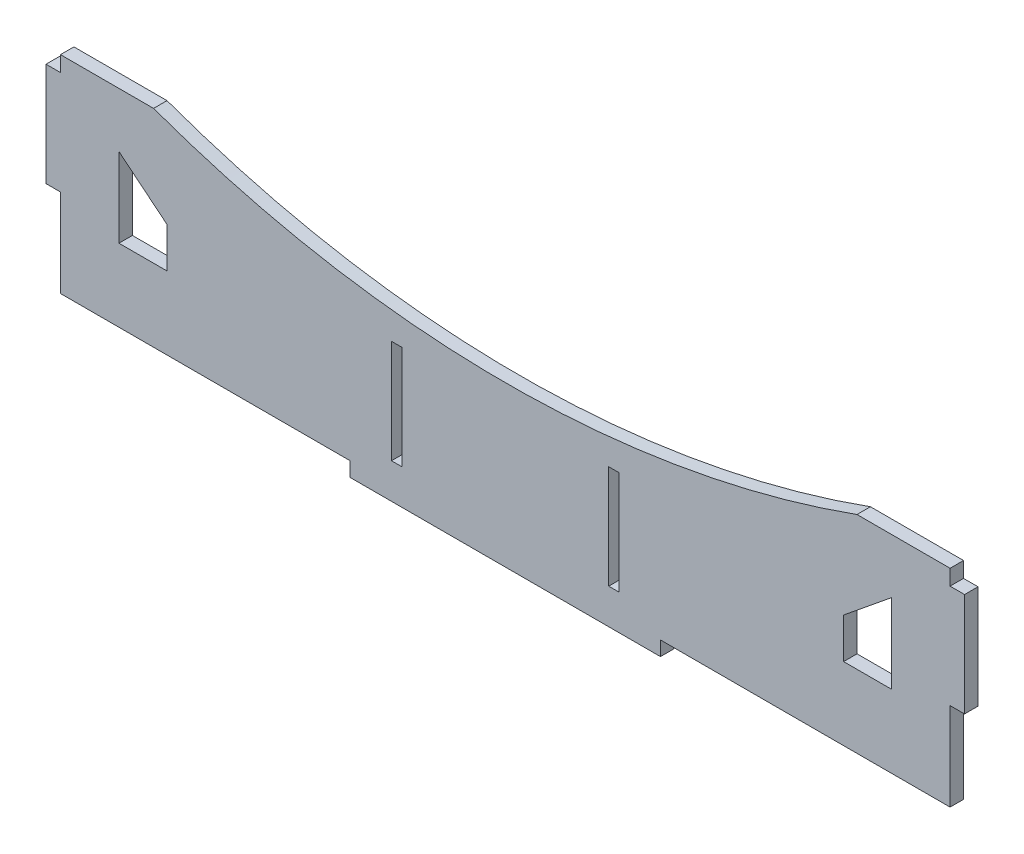
ISO-10303-21;
HEADER;
FILE_DESCRIPTION(('STEP AP214'),'2;1');
FILE_NAME('part.step','',(''),(''),'','','');
FILE_SCHEMA(('AUTOMOTIVE_DESIGN { 1 0 10303 214 1 1 1 1 }'));
ENDSEC;
DATA;
#1=APPLICATION_CONTEXT('core data for automotive mechanical design processes');
#2=APPLICATION_PROTOCOL_DEFINITION('international standard','automotive_design',2000,#1);
#3=PRODUCT_CONTEXT('',#1,'mechanical');
#4=PRODUCT('Part','Part','',(#3));
#5=PRODUCT_RELATED_PRODUCT_CATEGORY('part','',(#4));
#6=PRODUCT_DEFINITION_FORMATION('','',#4);
#7=PRODUCT_DEFINITION_CONTEXT('part definition',#1,'design');
#8=PRODUCT_DEFINITION('design','',#6,#7);
#9=PRODUCT_DEFINITION_SHAPE('','',#8);
#10=(LENGTH_UNIT() NAMED_UNIT(*) SI_UNIT(.MILLI.,.METRE.));
#11=(NAMED_UNIT(*) PLANE_ANGLE_UNIT() SI_UNIT($,.RADIAN.));
#12=(NAMED_UNIT(*) SI_UNIT($,.STERADIAN.) SOLID_ANGLE_UNIT());
#13=UNCERTAINTY_MEASURE_WITH_UNIT(LENGTH_MEASURE(1.E-05),#10,'distance_accuracy_value','');
#14=(GEOMETRIC_REPRESENTATION_CONTEXT(3) GLOBAL_UNCERTAINTY_ASSIGNED_CONTEXT((#13)) GLOBAL_UNIT_ASSIGNED_CONTEXT((#10,
#11,#12)) REPRESENTATION_CONTEXT('',''));
#15=CARTESIAN_POINT('',(0.,0.,0.));
#16=DIRECTION('',(0.,0.,1.));
#17=DIRECTION('',(1.,0.,0.));
#18=AXIS2_PLACEMENT_3D('',#15,#16,#17);
#19=CARTESIAN_POINT('',(-43.,10.,1.3));
#20=DIRECTION('',(0.,-1.,0.));
#21=DIRECTION('',(0.,0.,-1.));
#22=AXIS2_PLACEMENT_3D('',#19,#20,#21);
#23=PLANE('',#22);
#24=DIRECTION('',(-1.,0.,0.));
#25=VECTOR('',#24,1.);
#26=CARTESIAN_POINT('',(-43.,10.,0.));
#27=LINE('',#26,#25);
#28=CARTESIAN_POINT('',(43.,10.,0.));
#29=VERTEX_POINT('',#28);
#30=CARTESIAN_POINT('',(34.,9.99999999999999,0.));
#31=VERTEX_POINT('',#30);
#32=EDGE_CURVE('E594',#29,#31,#27,.T.);
#33=ORIENTED_EDGE('',*,*,#32,.T.);
#34=DIRECTION('',(0.,0.,1.));
#35=VECTOR('',#34,1.);
#36=CARTESIAN_POINT('',(34.,9.99999999999998,0.));
#37=LINE('',#36,#35);
#38=CARTESIAN_POINT('',(34.,9.99999999999998,1.3));
#39=VERTEX_POINT('',#38);
#40=EDGE_CURVE('E455',#31,#39,#37,.T.);
#41=ORIENTED_EDGE('',*,*,#40,.T.);
#42=DIRECTION('',(-1.,0.,0.));
#43=VECTOR('',#42,1.);
#44=CARTESIAN_POINT('',(-43.,10.,1.3));
#45=LINE('',#44,#43);
#46=CARTESIAN_POINT('',(43.,10.,1.3));
#47=VERTEX_POINT('',#46);
#48=EDGE_CURVE('E574',#47,#39,#45,.T.);
#49=ORIENTED_EDGE('',*,*,#48,.F.);
#50=DIRECTION('',(0.,0.,-1.));
#51=VECTOR('',#50,1.);
#52=CARTESIAN_POINT('',(43.,10.,1.3));
#53=LINE('',#52,#51);
#54=EDGE_CURVE('E11',#47,#29,#53,.T.);
#55=ORIENTED_EDGE('',*,*,#54,.T.);
#56=EDGE_LOOP('',(#33,#41,#49,#55));
#57=FACE_BOUND('',#56,.T.);
#58=ADVANCED_FACE('F42',(#57),#23,.F.);
#59=CARTESIAN_POINT('',(43.,10.,1.3));
#60=DIRECTION('',(-1.,0.,0.));
#61=DIRECTION('',(0.,0.,1.));
#62=AXIS2_PLACEMENT_3D('',#59,#60,#61);
#63=PLANE('',#62);
#64=DIRECTION('',(0.,0.,1.));
#65=VECTOR('',#64,1.);
#66=CARTESIAN_POINT('',(43.,8.5,0.));
#67=LINE('',#66,#65);
#68=CARTESIAN_POINT('',(43.,8.5,0.));
#69=VERTEX_POINT('',#68);
#70=CARTESIAN_POINT('',(43.,8.5,1.3));
#71=VERTEX_POINT('',#70);
#72=EDGE_CURVE('E459',#69,#71,#67,.T.);
#73=ORIENTED_EDGE('',*,*,#72,.F.);
#74=DIRECTION('',(0.,1.,0.));
#75=VECTOR('',#74,1.);
#76=CARTESIAN_POINT('',(43.,10.,0.));
#77=LINE('',#76,#75);
#78=EDGE_CURVE('E559',#69,#29,#77,.T.);
#79=ORIENTED_EDGE('',*,*,#78,.T.);
#80=ORIENTED_EDGE('',*,*,#54,.F.);
#81=DIRECTION('',(0.,1.,0.));
#82=VECTOR('',#81,1.);
#83=CARTESIAN_POINT('',(43.,10.,1.3));
#84=LINE('',#83,#82);
#85=EDGE_CURVE('E573',#71,#47,#84,.T.);
#86=ORIENTED_EDGE('',*,*,#85,.F.);
#87=EDGE_LOOP('',(#73,#79,#80,#86));
#88=FACE_BOUND('',#87,.T.);
#89=ADVANCED_FACE('F647',(#88),#63,.F.);
#90=CARTESIAN_POINT('',(-43.,10.,1.3));
#91=DIRECTION('',(1.,0.,0.));
#92=DIRECTION('',(0.,1.,0.));
#93=AXIS2_PLACEMENT_3D('',#90,#91,#92);
#94=PLANE('',#93);
#95=DIRECTION('',(0.,0.,1.));
#96=VECTOR('',#95,1.);
#97=CARTESIAN_POINT('',(-43.,-1.5,0.));
#98=LINE('',#97,#96);
#99=CARTESIAN_POINT('',(-43.,-1.5,0.));
#100=VERTEX_POINT('',#99);
#101=CARTESIAN_POINT('',(-43.,-1.5,1.3));
#102=VERTEX_POINT('',#101);
#103=EDGE_CURVE('E486',#100,#102,#98,.T.);
#104=ORIENTED_EDGE('',*,*,#103,.F.);
#105=DIRECTION('',(0.,-1.,0.));
#106=VECTOR('',#105,1.);
#107=CARTESIAN_POINT('',(-43.,10.,0.));
#108=LINE('',#107,#106);
#109=CARTESIAN_POINT('',(-43.,-10.,0.));
#110=VERTEX_POINT('',#109);
#111=EDGE_CURVE('E598',#100,#110,#108,.T.);
#112=ORIENTED_EDGE('',*,*,#111,.T.);
#113=DIRECTION('',(0.,0.,-1.));
#114=VECTOR('',#113,1.);
#115=CARTESIAN_POINT('',(-43.,-10.,1.3));
#116=LINE('',#115,#114);
#117=CARTESIAN_POINT('',(-43.,-10.,1.3));
#118=VERTEX_POINT('',#117);
#119=EDGE_CURVE('E611',#118,#110,#116,.T.);
#120=ORIENTED_EDGE('',*,*,#119,.F.);
#121=DIRECTION('',(0.,-1.,0.));
#122=VECTOR('',#121,1.);
#123=CARTESIAN_POINT('',(-43.,10.,1.3));
#124=LINE('',#123,#122);
#125=EDGE_CURVE('E578',#102,#118,#124,.T.);
#126=ORIENTED_EDGE('',*,*,#125,.F.);
#127=EDGE_LOOP('',(#104,#112,#120,#126));
#128=FACE_BOUND('',#127,.T.);
#129=ADVANCED_FACE('F690',(#128),#94,.F.);
#130=CARTESIAN_POINT('',(-43.,-10.,1.3));
#131=DIRECTION('',(0.,1.,0.));
#132=DIRECTION('',(0.,0.,1.));
#133=AXIS2_PLACEMENT_3D('',#130,#131,#132);
#134=PLANE('',#133);
#135=DIRECTION('',(0.,0.,1.));
#136=VECTOR('',#135,1.);
#137=CARTESIAN_POINT('',(15.,-10.,0.));
#138=LINE('',#137,#136);
#139=CARTESIAN_POINT('',(15.,-10.,0.));
#140=VERTEX_POINT('',#139);
#141=CARTESIAN_POINT('',(15.,-10.,1.3));
#142=VERTEX_POINT('',#141);
#143=EDGE_CURVE('E560',#140,#142,#138,.T.);
#144=ORIENTED_EDGE('',*,*,#143,.F.);
#145=DIRECTION('',(1.,0.,0.));
#146=VECTOR('',#145,1.);
#147=CARTESIAN_POINT('',(-43.,-10.,0.));
#148=LINE('',#147,#146);
#149=CARTESIAN_POINT('',(43.,-10.,0.));
#150=VERTEX_POINT('',#149);
#151=EDGE_CURVE('E603',#140,#150,#148,.T.);
#152=ORIENTED_EDGE('',*,*,#151,.T.);
#153=DIRECTION('',(0.,0.,-1.));
#154=VECTOR('',#153,1.);
#155=CARTESIAN_POINT('',(43.,-10.,1.3));
#156=LINE('',#155,#154);
#157=CARTESIAN_POINT('',(43.,-10.,1.3));
#158=VERTEX_POINT('',#157);
#159=EDGE_CURVE('E588',#158,#150,#156,.T.);
#160=ORIENTED_EDGE('',*,*,#159,.F.);
#161=DIRECTION('',(1.,0.,0.));
#162=VECTOR('',#161,1.);
#163=CARTESIAN_POINT('',(-43.,-10.,1.3));
#164=LINE('',#163,#162);
#165=EDGE_CURVE('E583',#142,#158,#164,.T.);
#166=ORIENTED_EDGE('',*,*,#165,.F.);
#167=EDGE_LOOP('',(#144,#152,#160,#166));
#168=FACE_BOUND('',#167,.T.);
#169=ADVANCED_FACE('F670',(#168),#134,.F.);
#170=CARTESIAN_POINT('',(43.,-1.5,0.));
#171=VERTEX_POINT('',#170);
#172=EDGE_CURVE('E589',#150,#171,#77,.T.);
#173=ORIENTED_EDGE('',*,*,#172,.T.);
#174=DIRECTION('',(0.,0.,1.));
#175=VECTOR('',#174,1.);
#176=CARTESIAN_POINT('',(43.,-1.5,0.));
#177=LINE('',#176,#175);
#178=CARTESIAN_POINT('',(43.,-1.5,1.3));
#179=VERTEX_POINT('',#178);
#180=EDGE_CURVE('E460',#171,#179,#177,.T.);
#181=ORIENTED_EDGE('',*,*,#180,.T.);
#182=EDGE_CURVE('E568',#158,#179,#84,.T.);
#183=ORIENTED_EDGE('',*,*,#182,.F.);
#184=ORIENTED_EDGE('',*,*,#159,.T.);
#185=EDGE_LOOP('',(#173,#181,#183,#184));
#186=FACE_BOUND('',#185,.T.);
#187=ADVANCED_FACE('F44',(#186),#63,.F.);
#188=CARTESIAN_POINT('',(-34.,9.99999999999999,1.3));
#189=VERTEX_POINT('',#188);
#190=CARTESIAN_POINT('',(-43.,10.,1.3));
#191=VERTEX_POINT('',#190);
#192=EDGE_CURVE('E572',#189,#191,#45,.T.);
#193=ORIENTED_EDGE('',*,*,#192,.F.);
#194=DIRECTION('',(0.,0.,1.));
#195=VECTOR('',#194,1.);
#196=CARTESIAN_POINT('',(-34.,9.99999999999999,0.));
#197=LINE('',#196,#195);
#198=CARTESIAN_POINT('',(-34.,9.99999999999999,0.));
#199=VERTEX_POINT('',#198);
#200=EDGE_CURVE('E450',#199,#189,#197,.T.);
#201=ORIENTED_EDGE('',*,*,#200,.F.);
#202=CARTESIAN_POINT('',(-43.,10.,0.));
#203=VERTEX_POINT('',#202);
#204=EDGE_CURVE('E593',#199,#203,#27,.T.);
#205=ORIENTED_EDGE('',*,*,#204,.T.);
#206=DIRECTION('',(0.,0.,-1.));
#207=VECTOR('',#206,1.);
#208=CARTESIAN_POINT('',(-43.,10.,1.3));
#209=LINE('',#208,#207);
#210=EDGE_CURVE('E51',#191,#203,#209,.T.);
#211=ORIENTED_EDGE('',*,*,#210,.F.);
#212=EDGE_LOOP('',(#193,#201,#205,#211));
#213=FACE_BOUND('',#212,.T.);
#214=ADVANCED_FACE('F705',(#213),#23,.F.);
#215=CARTESIAN_POINT('',(-43.,8.5,0.));
#216=VERTEX_POINT('',#215);
#217=EDGE_CURVE('E599',#203,#216,#108,.T.);
#218=ORIENTED_EDGE('',*,*,#217,.T.);
#219=DIRECTION('',(0.,0.,1.));
#220=VECTOR('',#219,1.);
#221=CARTESIAN_POINT('',(-43.,8.5,0.));
#222=LINE('',#221,#220);
#223=CARTESIAN_POINT('',(-43.,8.5,1.3));
#224=VERTEX_POINT('',#223);
#225=EDGE_CURVE('E496',#216,#224,#222,.T.);
#226=ORIENTED_EDGE('',*,*,#225,.T.);
#227=EDGE_CURVE('E579',#191,#224,#124,.T.);
#228=ORIENTED_EDGE('',*,*,#227,.F.);
#229=ORIENTED_EDGE('',*,*,#210,.T.);
#230=EDGE_LOOP('',(#218,#226,#228,#229));
#231=FACE_BOUND('',#230,.T.);
#232=ADVANCED_FACE('F620',(#231),#94,.F.);
#233=CARTESIAN_POINT('',(-15.,-10.,0.));
#234=VERTEX_POINT('',#233);
#235=EDGE_CURVE('E604',#110,#234,#148,.T.);
#236=ORIENTED_EDGE('',*,*,#235,.T.);
#237=DIRECTION('',(0.,0.,1.));
#238=VECTOR('',#237,1.);
#239=CARTESIAN_POINT('',(-15.,-10.,0.));
#240=LINE('',#239,#238);
#241=CARTESIAN_POINT('',(-15.,-10.,1.3));
#242=VERTEX_POINT('',#241);
#243=EDGE_CURVE('E555',#234,#242,#240,.T.);
#244=ORIENTED_EDGE('',*,*,#243,.T.);
#245=EDGE_CURVE('E584',#118,#242,#164,.T.);
#246=ORIENTED_EDGE('',*,*,#245,.F.);
#247=ORIENTED_EDGE('',*,*,#119,.T.);
#248=EDGE_LOOP('',(#236,#244,#246,#247));
#249=FACE_BOUND('',#248,.T.);
#250=ADVANCED_FACE('F684',(#249),#134,.F.);
#251=CARTESIAN_POINT('',(0.,0.,1.3));
#252=DIRECTION('',(0.,0.,1.));
#253=DIRECTION('',(1.,0.,0.));
#254=AXIS2_PLACEMENT_3D('',#251,#252,#253);
#255=PLANE('',#254);
#256=DIRECTION('',(-0.775483860451857,0.631367390810362,0.));
#257=VECTOR('',#256,1.);
#258=CARTESIAN_POINT('',(-32.708450107146,0.938053462051378,1.3));
#259=LINE('',#258,#257);
#260=CARTESIAN_POINT('',(-32.708450107146,0.938053462051378,1.3));
#261=VERTEX_POINT('',#260);
#262=CARTESIAN_POINT('',(-37.3472928064317,4.7148103499654,1.3));
#263=VERTEX_POINT('',#262);
#264=EDGE_CURVE('E58',#261,#263,#259,.T.);
#265=ORIENTED_EDGE('',*,*,#264,.F.);
#266=DIRECTION('',(0.,1.,0.));
#267=VECTOR('',#266,1.);
#268=CARTESIAN_POINT('',(-32.708450107146,-2.96185854177288,1.3));
#269=LINE('',#268,#267);
#270=CARTESIAN_POINT('',(-32.708450107146,-2.96185854177288,1.3));
#271=VERTEX_POINT('',#270);
#272=EDGE_CURVE('E288',#271,#261,#269,.T.);
#273=ORIENTED_EDGE('',*,*,#272,.F.);
#274=DIRECTION('',(1.,0.,0.));
#275=VECTOR('',#274,1.);
#276=CARTESIAN_POINT('',(-37.3472928064317,-2.96185854177288,1.3));
#277=LINE('',#276,#275);
#278=CARTESIAN_POINT('',(-37.3472928064317,-2.96185854177288,1.3));
#279=VERTEX_POINT('',#278);
#280=EDGE_CURVE('E292',#279,#271,#277,.T.);
#281=ORIENTED_EDGE('',*,*,#280,.F.);
#282=DIRECTION('',(0.,-1.,0.));
#283=VECTOR('',#282,1.);
#284=CARTESIAN_POINT('',(-37.3472928064317,4.7148103499654,1.3));
#285=LINE('',#284,#283);
#286=EDGE_CURVE('E301',#263,#279,#285,.T.);
#287=ORIENTED_EDGE('',*,*,#286,.F.);
#288=EDGE_LOOP('',(#265,#273,#281,#287));
#289=FACE_BOUND('',#288,.T.);
#290=DIRECTION('',(1.,0.,0.));
#291=VECTOR('',#290,1.);
#292=CARTESIAN_POINT('',(37.3472928064317,-2.96185854177288,1.3));
#293=LINE('',#292,#291);
#294=CARTESIAN_POINT('',(32.708450107146,-2.96185854177288,1.3));
#295=VERTEX_POINT('',#294);
#296=CARTESIAN_POINT('',(37.3472928064317,-2.96185854177288,1.3));
#297=VERTEX_POINT('',#296);
#298=EDGE_CURVE('E66',#295,#297,#293,.T.);
#299=ORIENTED_EDGE('',*,*,#298,.F.);
#300=DIRECTION('',(0.,-1.,0.));
#301=VECTOR('',#300,1.);
#302=CARTESIAN_POINT('',(32.708450107146,-2.96185854177288,1.3));
#303=LINE('',#302,#301);
#304=CARTESIAN_POINT('',(32.708450107146,0.938053462051378,1.3));
#305=VERTEX_POINT('',#304);
#306=EDGE_CURVE('E329',#305,#295,#303,.T.);
#307=ORIENTED_EDGE('',*,*,#306,.F.);
#308=DIRECTION('',(-0.775483860451857,-0.631367390810362,0.));
#309=VECTOR('',#308,1.);
#310=CARTESIAN_POINT('',(32.708450107146,0.938053462051378,1.3));
#311=LINE('',#310,#309);
#312=CARTESIAN_POINT('',(37.3472928064317,4.7148103499654,1.3));
#313=VERTEX_POINT('',#312);
#314=EDGE_CURVE('E333',#313,#305,#311,.T.);
#315=ORIENTED_EDGE('',*,*,#314,.F.);
#316=DIRECTION('',(0.,1.,0.));
#317=VECTOR('',#316,1.);
#318=CARTESIAN_POINT('',(37.3472928064317,4.7148103499654,1.3));
#319=LINE('',#318,#317);
#320=EDGE_CURVE('E338',#297,#313,#319,.T.);
#321=ORIENTED_EDGE('',*,*,#320,.F.);
#322=EDGE_LOOP('',(#299,#307,#315,#321));
#323=FACE_BOUND('',#322,.T.);
#324=DIRECTION('',(0.,1.,0.));
#325=VECTOR('',#324,1.);
#326=CARTESIAN_POINT('',(-10.,-8.,1.3));
#327=LINE('',#326,#325);
#328=CARTESIAN_POINT('',(-10.,-8.,1.3));
#329=VERTEX_POINT('',#328);
#330=CARTESIAN_POINT('',(-10.,2.,1.3));
#331=VERTEX_POINT('',#330);
#332=EDGE_CURVE('E376',#329,#331,#327,.T.);
#333=ORIENTED_EDGE('',*,*,#332,.F.);
#334=DIRECTION('',(1.,0.,0.));
#335=VECTOR('',#334,1.);
#336=CARTESIAN_POINT('',(-11.,-8.,1.3));
#337=LINE('',#336,#335);
#338=CARTESIAN_POINT('',(-11.,-8.,1.3));
#339=VERTEX_POINT('',#338);
#340=EDGE_CURVE('E363',#339,#329,#337,.T.);
#341=ORIENTED_EDGE('',*,*,#340,.F.);
#342=DIRECTION('',(0.,-1.,0.));
#343=VECTOR('',#342,1.);
#344=CARTESIAN_POINT('',(-11.,-8.,1.3));
#345=LINE('',#344,#343);
#346=CARTESIAN_POINT('',(-11.,2.,1.3));
#347=VERTEX_POINT('',#346);
#348=EDGE_CURVE('E384',#347,#339,#345,.T.);
#349=ORIENTED_EDGE('',*,*,#348,.F.);
#350=DIRECTION('',(-1.,0.,0.));
#351=VECTOR('',#350,1.);
#352=CARTESIAN_POINT('',(-11.,2.,1.3));
#353=LINE('',#352,#351);
#354=EDGE_CURVE('E379',#331,#347,#353,.T.);
#355=ORIENTED_EDGE('',*,*,#354,.F.);
#356=EDGE_LOOP('',(#333,#341,#349,#355));
#357=FACE_BOUND('',#356,.T.);
#358=DIRECTION('',(0.,1.,0.));
#359=VECTOR('',#358,1.);
#360=CARTESIAN_POINT('',(11.,-8.,1.3));
#361=LINE('',#360,#359);
#362=CARTESIAN_POINT('',(11.,-8.,1.3));
#363=VERTEX_POINT('',#362);
#364=CARTESIAN_POINT('',(11.,2.,1.3));
#365=VERTEX_POINT('',#364);
#366=EDGE_CURVE('E380',#363,#365,#361,.T.);
#367=ORIENTED_EDGE('',*,*,#366,.F.);
#368=DIRECTION('',(1.,0.,0.));
#369=VECTOR('',#368,1.);
#370=CARTESIAN_POINT('',(10.,-8.,1.3));
#371=LINE('',#370,#369);
#372=CARTESIAN_POINT('',(10.,-8.,1.3));
#373=VERTEX_POINT('',#372);
#374=EDGE_CURVE('E417',#373,#363,#371,.T.);
#375=ORIENTED_EDGE('',*,*,#374,.F.);
#376=DIRECTION('',(0.,-1.,0.));
#377=VECTOR('',#376,1.);
#378=CARTESIAN_POINT('',(10.,-8.,1.3));
#379=LINE('',#378,#377);
#380=CARTESIAN_POINT('',(10.,2.,1.3));
#381=VERTEX_POINT('',#380);
#382=EDGE_CURVE('E421',#381,#373,#379,.T.);
#383=ORIENTED_EDGE('',*,*,#382,.F.);
#384=DIRECTION('',(-1.,0.,0.));
#385=VECTOR('',#384,1.);
#386=CARTESIAN_POINT('',(10.,2.,1.3));
#387=LINE('',#386,#385);
#388=EDGE_CURVE('E426',#365,#381,#387,.T.);
#389=ORIENTED_EDGE('',*,*,#388,.F.);
#390=EDGE_LOOP('',(#367,#375,#383,#389));
#391=FACE_BOUND('',#390,.T.);
#392=CARTESIAN_POINT('',(0.,103.896477348727,1.3));
#393=DIRECTION('',(0.,0.,1.));
#394=DIRECTION('',(1.,0.,0.));
#395=AXIS2_PLACEMENT_3D('',#392,#393,#394);
#396=CIRCLE('',#395,99.8626479645917);
#397=EDGE_CURVE('E394',#189,#39,#396,.T.);
#398=ORIENTED_EDGE('',*,*,#397,.F.);
#399=ORIENTED_EDGE('',*,*,#192,.T.);
#400=ORIENTED_EDGE('',*,*,#227,.T.);
#401=DIRECTION('',(-1.,0.,0.));
#402=VECTOR('',#401,1.);
#403=CARTESIAN_POINT('',(-43.,8.5,1.3));
#404=LINE('',#403,#402);
#405=CARTESIAN_POINT('',(-44.4,8.5,1.3));
#406=VERTEX_POINT('',#405);
#407=EDGE_CURVE('E518',#224,#406,#404,.T.);
#408=ORIENTED_EDGE('',*,*,#407,.T.);
#409=DIRECTION('',(0.,-1.,0.));
#410=VECTOR('',#409,1.);
#411=CARTESIAN_POINT('',(-44.4,8.5,1.3));
#412=LINE('',#411,#410);
#413=CARTESIAN_POINT('',(-44.4,-1.5,1.3));
#414=VERTEX_POINT('',#413);
#415=EDGE_CURVE('E513',#406,#414,#412,.T.);
#416=ORIENTED_EDGE('',*,*,#415,.T.);
#417=DIRECTION('',(1.,0.,0.));
#418=VECTOR('',#417,1.);
#419=CARTESIAN_POINT('',(-43.,-1.5,1.3));
#420=LINE('',#419,#418);
#421=EDGE_CURVE('E509',#414,#102,#420,.T.);
#422=ORIENTED_EDGE('',*,*,#421,.T.);
#423=ORIENTED_EDGE('',*,*,#125,.T.);
#424=ORIENTED_EDGE('',*,*,#245,.T.);
#425=DIRECTION('',(0.,-1.,0.));
#426=VECTOR('',#425,1.);
#427=CARTESIAN_POINT('',(-15.,-10.,1.3));
#428=LINE('',#427,#426);
#429=CARTESIAN_POINT('',(-15.,-11.4,1.3));
#430=VERTEX_POINT('',#429);
#431=EDGE_CURVE('E522',#242,#430,#428,.T.);
#432=ORIENTED_EDGE('',*,*,#431,.T.);
#433=DIRECTION('',(1.,0.,0.));
#434=VECTOR('',#433,1.);
#435=CARTESIAN_POINT('',(-15.,-11.4,1.3));
#436=LINE('',#435,#434);
#437=CARTESIAN_POINT('',(15.,-11.4,1.3));
#438=VERTEX_POINT('',#437);
#439=EDGE_CURVE('E548',#430,#438,#436,.T.);
#440=ORIENTED_EDGE('',*,*,#439,.T.);
#441=DIRECTION('',(0.,1.,0.));
#442=VECTOR('',#441,1.);
#443=CARTESIAN_POINT('',(15.,-10.,1.3));
#444=LINE('',#443,#442);
#445=EDGE_CURVE('E537',#438,#142,#444,.T.);
#446=ORIENTED_EDGE('',*,*,#445,.T.);
#447=ORIENTED_EDGE('',*,*,#165,.T.);
#448=ORIENTED_EDGE('',*,*,#182,.T.);
#449=DIRECTION('',(1.,0.,0.));
#450=VECTOR('',#449,1.);
#451=CARTESIAN_POINT('',(43.,-1.5,1.3));
#452=LINE('',#451,#450);
#453=CARTESIAN_POINT('',(44.4,-1.5,1.3));
#454=VERTEX_POINT('',#453);
#455=EDGE_CURVE('E482',#179,#454,#452,.T.);
#456=ORIENTED_EDGE('',*,*,#455,.T.);
#457=DIRECTION('',(0.,1.,0.));
#458=VECTOR('',#457,1.);
#459=CARTESIAN_POINT('',(44.4,8.5,1.3));
#460=LINE('',#459,#458);
#461=CARTESIAN_POINT('',(44.4,8.5,1.3));
#462=VERTEX_POINT('',#461);
#463=EDGE_CURVE('E477',#454,#462,#460,.T.);
#464=ORIENTED_EDGE('',*,*,#463,.T.);
#465=DIRECTION('',(-1.,0.,0.));
#466=VECTOR('',#465,1.);
#467=CARTESIAN_POINT('',(43.,8.5,1.3));
#468=LINE('',#467,#466);
#469=EDGE_CURVE('E473',#462,#71,#468,.T.);
#470=ORIENTED_EDGE('',*,*,#469,.T.);
#471=ORIENTED_EDGE('',*,*,#85,.T.);
#472=ORIENTED_EDGE('',*,*,#48,.T.);
#473=EDGE_LOOP('',(#398,#399,#400,#408,#416,#422,#423,#424,#432,#440,#446,#447,#448,#456,#464,
#470,#471,#472));
#474=FACE_BOUND('',#473,.T.);
#475=ADVANCED_FACE('F633',(#289,#323,#357,#391,#474),#255,.T.);
#476=CARTESIAN_POINT('',(0.,0.,0.));
#477=DIRECTION('',(0.,0.,1.));
#478=DIRECTION('',(1.,0.,0.));
#479=AXIS2_PLACEMENT_3D('',#476,#477,#478);
#480=PLANE('',#479);
#481=DIRECTION('',(0.,1.,0.));
#482=VECTOR('',#481,1.);
#483=CARTESIAN_POINT('',(-32.708450107146,-2.96185854177288,0.));
#484=LINE('',#483,#482);
#485=CARTESIAN_POINT('',(-32.708450107146,-2.96185854177288,0.));
#486=VERTEX_POINT('',#485);
#487=CARTESIAN_POINT('',(-32.708450107146,0.938053462051378,0.));
#488=VERTEX_POINT('',#487);
#489=EDGE_CURVE('E273',#486,#488,#484,.T.);
#490=ORIENTED_EDGE('',*,*,#489,.T.);
#491=DIRECTION('',(-0.775483860451857,0.631367390810362,0.));
#492=VECTOR('',#491,1.);
#493=CARTESIAN_POINT('',(-32.708450107146,0.938053462051378,0.));
#494=LINE('',#493,#492);
#495=CARTESIAN_POINT('',(-37.3472928064317,4.7148103499654,0.));
#496=VERTEX_POINT('',#495);
#497=EDGE_CURVE('E266',#488,#496,#494,.T.);
#498=ORIENTED_EDGE('',*,*,#497,.T.);
#499=DIRECTION('',(0.,-1.,0.));
#500=VECTOR('',#499,1.);
#501=CARTESIAN_POINT('',(-37.3472928064317,4.7148103499654,0.));
#502=LINE('',#501,#500);
#503=CARTESIAN_POINT('',(-37.3472928064317,-2.96185854177288,0.));
#504=VERTEX_POINT('',#503);
#505=EDGE_CURVE('E277',#496,#504,#502,.T.);
#506=ORIENTED_EDGE('',*,*,#505,.T.);
#507=DIRECTION('',(1.,0.,0.));
#508=VECTOR('',#507,1.);
#509=CARTESIAN_POINT('',(-37.3472928064317,-2.96185854177288,0.));
#510=LINE('',#509,#508);
#511=EDGE_CURVE('E282',#504,#486,#510,.T.);
#512=ORIENTED_EDGE('',*,*,#511,.T.);
#513=EDGE_LOOP('',(#490,#498,#506,#512));
#514=FACE_BOUND('',#513,.T.);
#515=DIRECTION('',(0.,-1.,0.));
#516=VECTOR('',#515,1.);
#517=CARTESIAN_POINT('',(32.708450107146,-2.96185854177288,0.));
#518=LINE('',#517,#516);
#519=CARTESIAN_POINT('',(32.708450107146,0.938053462051378,0.));
#520=VERTEX_POINT('',#519);
#521=CARTESIAN_POINT('',(32.708450107146,-2.96185854177288,0.));
#522=VERTEX_POINT('',#521);
#523=EDGE_CURVE('E319',#520,#522,#518,.T.);
#524=ORIENTED_EDGE('',*,*,#523,.T.);
#525=DIRECTION('',(1.,0.,0.));
#526=VECTOR('',#525,1.);
#527=CARTESIAN_POINT('',(37.3472928064317,-2.96185854177288,0.));
#528=LINE('',#527,#526);
#529=CARTESIAN_POINT('',(37.3472928064317,-2.96185854177288,0.));
#530=VERTEX_POINT('',#529);
#531=EDGE_CURVE('E334',#522,#530,#528,.T.);
#532=ORIENTED_EDGE('',*,*,#531,.T.);
#533=DIRECTION('',(0.,1.,0.));
#534=VECTOR('',#533,1.);
#535=CARTESIAN_POINT('',(37.3472928064317,4.7148103499654,0.));
#536=LINE('',#535,#534);
#537=CARTESIAN_POINT('',(37.3472928064317,4.7148103499654,0.));
#538=VERTEX_POINT('',#537);
#539=EDGE_CURVE('E351',#530,#538,#536,.T.);
#540=ORIENTED_EDGE('',*,*,#539,.T.);
#541=DIRECTION('',(-0.775483860451857,-0.631367390810362,0.));
#542=VECTOR('',#541,1.);
#543=CARTESIAN_POINT('',(32.708450107146,0.938053462051378,0.));
#544=LINE('',#543,#542);
#545=EDGE_CURVE('E347',#538,#520,#544,.T.);
#546=ORIENTED_EDGE('',*,*,#545,.T.);
#547=EDGE_LOOP('',(#524,#532,#540,#546));
#548=FACE_BOUND('',#547,.T.);
#549=DIRECTION('',(1.,0.,0.));
#550=VECTOR('',#549,1.);
#551=CARTESIAN_POINT('',(-11.,-8.,0.));
#552=LINE('',#551,#550);
#553=CARTESIAN_POINT('',(-11.,-8.,0.));
#554=VERTEX_POINT('',#553);
#555=CARTESIAN_POINT('',(-10.,-8.,0.));
#556=VERTEX_POINT('',#555);
#557=EDGE_CURVE('E371',#554,#556,#552,.T.);
#558=ORIENTED_EDGE('',*,*,#557,.T.);
#559=DIRECTION('',(0.,1.,0.));
#560=VECTOR('',#559,1.);
#561=CARTESIAN_POINT('',(-10.,-8.,0.));
#562=LINE('',#561,#560);
#563=CARTESIAN_POINT('',(-10.,2.,0.));
#564=VERTEX_POINT('',#563);
#565=EDGE_CURVE('E358',#556,#564,#562,.T.);
#566=ORIENTED_EDGE('',*,*,#565,.T.);
#567=DIRECTION('',(-1.,0.,0.));
#568=VECTOR('',#567,1.);
#569=CARTESIAN_POINT('',(-11.,2.,0.));
#570=LINE('',#569,#568);
#571=CARTESIAN_POINT('',(-11.,2.,0.));
#572=VERTEX_POINT('',#571);
#573=EDGE_CURVE('E362',#564,#572,#570,.T.);
#574=ORIENTED_EDGE('',*,*,#573,.T.);
#575=DIRECTION('',(0.,-1.,0.));
#576=VECTOR('',#575,1.);
#577=CARTESIAN_POINT('',(-11.,-8.,0.));
#578=LINE('',#577,#576);
#579=EDGE_CURVE('E367',#572,#554,#578,.T.);
#580=ORIENTED_EDGE('',*,*,#579,.T.);
#581=EDGE_LOOP('',(#558,#566,#574,#580));
#582=FACE_BOUND('',#581,.T.);
#583=DIRECTION('',(1.,0.,0.));
#584=VECTOR('',#583,1.);
#585=CARTESIAN_POINT('',(10.,-8.,0.));
#586=LINE('',#585,#584);
#587=CARTESIAN_POINT('',(10.,-8.,0.));
#588=VERTEX_POINT('',#587);
#589=CARTESIAN_POINT('',(11.,-8.,0.));
#590=VERTEX_POINT('',#589);
#591=EDGE_CURVE('E408',#588,#590,#586,.T.);
#592=ORIENTED_EDGE('',*,*,#591,.T.);
#593=DIRECTION('',(0.,1.,0.));
#594=VECTOR('',#593,1.);
#595=CARTESIAN_POINT('',(11.,-8.,0.));
#596=LINE('',#595,#594);
#597=CARTESIAN_POINT('',(11.,2.,0.));
#598=VERTEX_POINT('',#597);
#599=EDGE_CURVE('E422',#590,#598,#596,.T.);
#600=ORIENTED_EDGE('',*,*,#599,.T.);
#601=DIRECTION('',(-1.,0.,0.));
#602=VECTOR('',#601,1.);
#603=CARTESIAN_POINT('',(10.,2.,0.));
#604=LINE('',#603,#602);
#605=CARTESIAN_POINT('',(10.,2.,0.));
#606=VERTEX_POINT('',#605);
#607=EDGE_CURVE('E439',#598,#606,#604,.T.);
#608=ORIENTED_EDGE('',*,*,#607,.T.);
#609=DIRECTION('',(0.,-1.,0.));
#610=VECTOR('',#609,1.);
#611=CARTESIAN_POINT('',(10.,-8.,0.));
#612=LINE('',#611,#610);
#613=EDGE_CURVE('E435',#606,#588,#612,.T.);
#614=ORIENTED_EDGE('',*,*,#613,.T.);
#615=EDGE_LOOP('',(#592,#600,#608,#614));
#616=FACE_BOUND('',#615,.T.);
#617=ORIENTED_EDGE('',*,*,#204,.F.);
#618=CARTESIAN_POINT('',(0.,103.896477348727,0.));
#619=DIRECTION('',(0.,0.,1.));
#620=DIRECTION('',(1.,0.,0.));
#621=AXIS2_PLACEMENT_3D('',#618,#619,#620);
#622=CIRCLE('',#621,99.8626479645917);
#623=EDGE_CURVE('E446',#199,#31,#622,.T.);
#624=ORIENTED_EDGE('',*,*,#623,.T.);
#625=ORIENTED_EDGE('',*,*,#32,.F.);
#626=ORIENTED_EDGE('',*,*,#78,.F.);
#627=DIRECTION('',(-1.,0.,0.));
#628=VECTOR('',#627,1.);
#629=CARTESIAN_POINT('',(43.,8.5,0.));
#630=LINE('',#629,#628);
#631=CARTESIAN_POINT('',(44.4,8.5,0.));
#632=VERTEX_POINT('',#631);
#633=EDGE_CURVE('E464',#632,#69,#630,.T.);
#634=ORIENTED_EDGE('',*,*,#633,.F.);
#635=DIRECTION('',(0.,1.,0.));
#636=VECTOR('',#635,1.);
#637=CARTESIAN_POINT('',(44.4,8.5,0.));
#638=LINE('',#637,#636);
#639=CARTESIAN_POINT('',(44.4,-1.5,0.));
#640=VERTEX_POINT('',#639);
#641=EDGE_CURVE('E489',#640,#632,#638,.T.);
#642=ORIENTED_EDGE('',*,*,#641,.F.);
#643=DIRECTION('',(1.,0.,0.));
#644=VECTOR('',#643,1.);
#645=CARTESIAN_POINT('',(43.,-1.5,0.));
#646=LINE('',#645,#644);
#647=EDGE_CURVE('E478',#171,#640,#646,.T.);
#648=ORIENTED_EDGE('',*,*,#647,.F.);
#649=ORIENTED_EDGE('',*,*,#172,.F.);
#650=ORIENTED_EDGE('',*,*,#151,.F.);
#651=DIRECTION('',(0.,1.,0.));
#652=VECTOR('',#651,1.);
#653=CARTESIAN_POINT('',(15.,-10.,0.));
#654=LINE('',#653,#652);
#655=CARTESIAN_POINT('',(15.,-11.4,0.));
#656=VERTEX_POINT('',#655);
#657=EDGE_CURVE('E541',#656,#140,#654,.T.);
#658=ORIENTED_EDGE('',*,*,#657,.F.);
#659=DIRECTION('',(1.,0.,0.));
#660=VECTOR('',#659,1.);
#661=CARTESIAN_POINT('',(-15.,-11.4,0.));
#662=LINE('',#661,#660);
#663=CARTESIAN_POINT('',(-15.,-11.4,0.));
#664=VERTEX_POINT('',#663);
#665=EDGE_CURVE('E536',#664,#656,#662,.T.);
#666=ORIENTED_EDGE('',*,*,#665,.F.);
#667=DIRECTION('',(0.,-1.,0.));
#668=VECTOR('',#667,1.);
#669=CARTESIAN_POINT('',(-15.,-10.,0.));
#670=LINE('',#669,#668);
#671=EDGE_CURVE('E532',#234,#664,#670,.T.);
#672=ORIENTED_EDGE('',*,*,#671,.F.);
#673=ORIENTED_EDGE('',*,*,#235,.F.);
#674=ORIENTED_EDGE('',*,*,#111,.F.);
#675=DIRECTION('',(1.,0.,0.));
#676=VECTOR('',#675,1.);
#677=CARTESIAN_POINT('',(-43.,-1.5,0.));
#678=LINE('',#677,#676);
#679=CARTESIAN_POINT('',(-44.4,-1.5,0.));
#680=VERTEX_POINT('',#679);
#681=EDGE_CURVE('E500',#680,#100,#678,.T.);
#682=ORIENTED_EDGE('',*,*,#681,.F.);
#683=DIRECTION('',(0.,-1.,0.));
#684=VECTOR('',#683,1.);
#685=CARTESIAN_POINT('',(-44.4,8.5,0.));
#686=LINE('',#685,#684);
#687=CARTESIAN_POINT('',(-44.4,8.5,0.));
#688=VERTEX_POINT('',#687);
#689=EDGE_CURVE('E525',#688,#680,#686,.T.);
#690=ORIENTED_EDGE('',*,*,#689,.F.);
#691=DIRECTION('',(-1.,0.,0.));
#692=VECTOR('',#691,1.);
#693=CARTESIAN_POINT('',(-43.,8.5,0.));
#694=LINE('',#693,#692);
#695=EDGE_CURVE('E514',#216,#688,#694,.T.);
#696=ORIENTED_EDGE('',*,*,#695,.F.);
#697=ORIENTED_EDGE('',*,*,#217,.F.);
#698=EDGE_LOOP('',(#617,#624,#625,#626,#634,#642,#648,#649,#650,#658,#666,#672,#673,#674,#682,
#690,#696,#697));
#699=FACE_BOUND('',#698,.T.);
#700=ADVANCED_FACE('F284',(#514,#548,#582,#616,#699),#480,.F.);
#701=CARTESIAN_POINT('',(-15.,-10.,0.));
#702=DIRECTION('',(-1.,0.,0.));
#703=DIRECTION('',(0.,0.,1.));
#704=AXIS2_PLACEMENT_3D('',#701,#702,#703);
#705=PLANE('',#704);
#706=ORIENTED_EDGE('',*,*,#431,.F.);
#707=ORIENTED_EDGE('',*,*,#243,.F.);
#708=ORIENTED_EDGE('',*,*,#671,.T.);
#709=DIRECTION('',(0.,0.,1.));
#710=VECTOR('',#709,1.);
#711=CARTESIAN_POINT('',(-15.,-11.4,0.));
#712=LINE('',#711,#710);
#713=EDGE_CURVE('E544',#664,#430,#712,.T.);
#714=ORIENTED_EDGE('',*,*,#713,.T.);
#715=EDGE_LOOP('',(#706,#707,#708,#714));
#716=FACE_BOUND('',#715,.T.);
#717=ADVANCED_FACE('F680',(#716),#705,.T.);
#718=CARTESIAN_POINT('',(15.,-10.,0.));
#719=DIRECTION('',(1.,0.,0.));
#720=DIRECTION('',(0.,0.,-1.));
#721=AXIS2_PLACEMENT_3D('',#718,#719,#720);
#722=PLANE('',#721);
#723=ORIENTED_EDGE('',*,*,#445,.F.);
#724=DIRECTION('',(0.,0.,1.));
#725=VECTOR('',#724,1.);
#726=CARTESIAN_POINT('',(15.,-11.4,0.));
#727=LINE('',#726,#725);
#728=EDGE_CURVE('E563',#656,#438,#727,.T.);
#729=ORIENTED_EDGE('',*,*,#728,.F.);
#730=ORIENTED_EDGE('',*,*,#657,.T.);
#731=ORIENTED_EDGE('',*,*,#143,.T.);
#732=EDGE_LOOP('',(#723,#729,#730,#731));
#733=FACE_BOUND('',#732,.T.);
#734=ADVANCED_FACE('F740',(#733),#722,.T.);
#735=CARTESIAN_POINT('',(-15.,-11.4,0.));
#736=DIRECTION('',(0.,-1.,0.));
#737=DIRECTION('',(1.,0.,0.));
#738=AXIS2_PLACEMENT_3D('',#735,#736,#737);
#739=PLANE('',#738);
#740=ORIENTED_EDGE('',*,*,#439,.F.);
#741=ORIENTED_EDGE('',*,*,#713,.F.);
#742=ORIENTED_EDGE('',*,*,#665,.T.);
#743=ORIENTED_EDGE('',*,*,#728,.T.);
#744=EDGE_LOOP('',(#740,#741,#742,#743));
#745=FACE_BOUND('',#744,.T.);
#746=ADVANCED_FACE('F678',(#745),#739,.T.);
#747=CARTESIAN_POINT('',(-43.,-1.5,0.));
#748=DIRECTION('',(0.,-1.,0.));
#749=DIRECTION('',(0.,0.,-1.));
#750=AXIS2_PLACEMENT_3D('',#747,#748,#749);
#751=PLANE('',#750);
#752=ORIENTED_EDGE('',*,*,#421,.F.);
#753=DIRECTION('',(0.,0.,1.));
#754=VECTOR('',#753,1.);
#755=CARTESIAN_POINT('',(-44.4,-1.5,0.));
#756=LINE('',#755,#754);
#757=EDGE_CURVE('E504',#680,#414,#756,.T.);
#758=ORIENTED_EDGE('',*,*,#757,.F.);
#759=ORIENTED_EDGE('',*,*,#681,.T.);
#760=ORIENTED_EDGE('',*,*,#103,.T.);
#761=EDGE_LOOP('',(#752,#758,#759,#760));
#762=FACE_BOUND('',#761,.T.);
#763=ADVANCED_FACE('F693',(#762),#751,.T.);
#764=CARTESIAN_POINT('',(-44.4,8.5,0.));
#765=DIRECTION('',(-1.,0.,0.));
#766=DIRECTION('',(0.,0.,1.));
#767=AXIS2_PLACEMENT_3D('',#764,#765,#766);
#768=PLANE('',#767);
#769=ORIENTED_EDGE('',*,*,#415,.F.);
#770=DIRECTION('',(0.,0.,1.));
#771=VECTOR('',#770,1.);
#772=CARTESIAN_POINT('',(-44.4,8.5,0.));
#773=LINE('',#772,#771);
#774=EDGE_CURVE('E501',#688,#406,#773,.T.);
#775=ORIENTED_EDGE('',*,*,#774,.F.);
#776=ORIENTED_EDGE('',*,*,#689,.T.);
#777=ORIENTED_EDGE('',*,*,#757,.T.);
#778=EDGE_LOOP('',(#769,#775,#776,#777));
#779=FACE_BOUND('',#778,.T.);
#780=ADVANCED_FACE('F695',(#779),#768,.T.);
#781=CARTESIAN_POINT('',(-43.,8.5,0.));
#782=DIRECTION('',(0.,1.,0.));
#783=DIRECTION('',(0.,0.,1.));
#784=AXIS2_PLACEMENT_3D('',#781,#782,#783);
#785=PLANE('',#784);
#786=ORIENTED_EDGE('',*,*,#407,.F.);
#787=ORIENTED_EDGE('',*,*,#225,.F.);
#788=ORIENTED_EDGE('',*,*,#695,.T.);
#789=ORIENTED_EDGE('',*,*,#774,.T.);
#790=EDGE_LOOP('',(#786,#787,#788,#789));
#791=FACE_BOUND('',#790,.T.);
#792=ADVANCED_FACE('F629',(#791),#785,.T.);
#793=CARTESIAN_POINT('',(43.,8.5,0.));
#794=DIRECTION('',(0.,1.,0.));
#795=DIRECTION('',(-1.,0.,0.));
#796=AXIS2_PLACEMENT_3D('',#793,#794,#795);
#797=PLANE('',#796);
#798=ORIENTED_EDGE('',*,*,#469,.F.);
#799=DIRECTION('',(0.,0.,1.));
#800=VECTOR('',#799,1.);
#801=CARTESIAN_POINT('',(44.4,8.5,0.));
#802=LINE('',#801,#800);
#803=EDGE_CURVE('E468',#632,#462,#802,.T.);
#804=ORIENTED_EDGE('',*,*,#803,.F.);
#805=ORIENTED_EDGE('',*,*,#633,.T.);
#806=ORIENTED_EDGE('',*,*,#72,.T.);
#807=EDGE_LOOP('',(#798,#804,#805,#806));
#808=FACE_BOUND('',#807,.T.);
#809=ADVANCED_FACE('F655',(#808),#797,.T.);
#810=CARTESIAN_POINT('',(44.4,8.5,0.));
#811=DIRECTION('',(1.,0.,0.));
#812=DIRECTION('',(0.,0.,-1.));
#813=AXIS2_PLACEMENT_3D('',#810,#811,#812);
#814=PLANE('',#813);
#815=ORIENTED_EDGE('',*,*,#463,.F.);
#816=DIRECTION('',(0.,0.,1.));
#817=VECTOR('',#816,1.);
#818=CARTESIAN_POINT('',(44.4,-1.5,0.));
#819=LINE('',#818,#817);
#820=EDGE_CURVE('E465',#640,#454,#819,.T.);
#821=ORIENTED_EDGE('',*,*,#820,.F.);
#822=ORIENTED_EDGE('',*,*,#641,.T.);
#823=ORIENTED_EDGE('',*,*,#803,.T.);
#824=EDGE_LOOP('',(#815,#821,#822,#823));
#825=FACE_BOUND('',#824,.T.);
#826=ADVANCED_FACE('F778',(#825),#814,.T.);
#827=CARTESIAN_POINT('',(43.,-1.5,0.));
#828=DIRECTION('',(0.,-1.,0.));
#829=DIRECTION('',(0.,0.,-1.));
#830=AXIS2_PLACEMENT_3D('',#827,#828,#829);
#831=PLANE('',#830);
#832=ORIENTED_EDGE('',*,*,#455,.F.);
#833=ORIENTED_EDGE('',*,*,#180,.F.);
#834=ORIENTED_EDGE('',*,*,#647,.T.);
#835=ORIENTED_EDGE('',*,*,#820,.T.);
#836=EDGE_LOOP('',(#832,#833,#834,#835));
#837=FACE_BOUND('',#836,.T.);
#838=ADVANCED_FACE('F661',(#837),#831,.T.);
#839=CARTESIAN_POINT('',(0.,103.896477348727,0.));
#840=DIRECTION('',(0.,0.,1.));
#841=DIRECTION('',(1.,0.,0.));
#842=AXIS2_PLACEMENT_3D('',#839,#840,#841);
#843=CYLINDRICAL_SURFACE('',#842,99.8626479645917);
#844=ORIENTED_EDGE('',*,*,#397,.T.);
#845=ORIENTED_EDGE('',*,*,#40,.F.);
#846=ORIENTED_EDGE('',*,*,#623,.F.);
#847=ORIENTED_EDGE('',*,*,#200,.T.);
#848=EDGE_LOOP('',(#844,#845,#846,#847));
#849=FACE_BOUND('',#848,.T.);
#850=ADVANCED_FACE('F795',(#849),#843,.F.);
#851=CARTESIAN_POINT('',(11.,-8.,0.));
#852=DIRECTION('',(1.,0.,0.));
#853=DIRECTION('',(0.,0.,-1.));
#854=AXIS2_PLACEMENT_3D('',#851,#852,#853);
#855=PLANE('',#854);
#856=ORIENTED_EDGE('',*,*,#366,.T.);
#857=DIRECTION('',(0.,0.,1.));
#858=VECTOR('',#857,1.);
#859=CARTESIAN_POINT('',(11.,2.,0.));
#860=LINE('',#859,#858);
#861=EDGE_CURVE('E404',#598,#365,#860,.T.);
#862=ORIENTED_EDGE('',*,*,#861,.F.);
#863=ORIENTED_EDGE('',*,*,#599,.F.);
#864=DIRECTION('',(0.,0.,1.));
#865=VECTOR('',#864,1.);
#866=CARTESIAN_POINT('',(11.,-8.,0.));
#867=LINE('',#866,#865);
#868=EDGE_CURVE('E310',#590,#363,#867,.T.);
#869=ORIENTED_EDGE('',*,*,#868,.T.);
#870=EDGE_LOOP('',(#856,#862,#863,#869));
#871=FACE_BOUND('',#870,.T.);
#872=ADVANCED_FACE('F810',(#871),#855,.F.);
#873=CARTESIAN_POINT('',(10.,-8.,0.));
#874=DIRECTION('',(0.,-1.,0.));
#875=DIRECTION('',(0.,0.,-1.));
#876=AXIS2_PLACEMENT_3D('',#873,#874,#875);
#877=PLANE('',#876);
#878=ORIENTED_EDGE('',*,*,#374,.T.);
#879=ORIENTED_EDGE('',*,*,#868,.F.);
#880=ORIENTED_EDGE('',*,*,#591,.F.);
#881=DIRECTION('',(0.,0.,1.));
#882=VECTOR('',#881,1.);
#883=CARTESIAN_POINT('',(10.,-8.,0.));
#884=LINE('',#883,#882);
#885=EDGE_CURVE('E412',#588,#373,#884,.T.);
#886=ORIENTED_EDGE('',*,*,#885,.T.);
#887=EDGE_LOOP('',(#878,#879,#880,#886));
#888=FACE_BOUND('',#887,.T.);
#889=ADVANCED_FACE('F817',(#888),#877,.F.);
#890=CARTESIAN_POINT('',(10.,-8.,0.));
#891=DIRECTION('',(-1.,0.,0.));
#892=DIRECTION('',(0.,0.,1.));
#893=AXIS2_PLACEMENT_3D('',#890,#891,#892);
#894=PLANE('',#893);
#895=ORIENTED_EDGE('',*,*,#382,.T.);
#896=ORIENTED_EDGE('',*,*,#885,.F.);
#897=ORIENTED_EDGE('',*,*,#613,.F.);
#898=DIRECTION('',(0.,0.,1.));
#899=VECTOR('',#898,1.);
#900=CARTESIAN_POINT('',(10.,2.,0.));
#901=LINE('',#900,#899);
#902=EDGE_CURVE('E409',#606,#381,#901,.T.);
#903=ORIENTED_EDGE('',*,*,#902,.T.);
#904=EDGE_LOOP('',(#895,#896,#897,#903));
#905=FACE_BOUND('',#904,.T.);
#906=ADVANCED_FACE('F825',(#905),#894,.F.);
#907=CARTESIAN_POINT('',(10.,2.,0.));
#908=DIRECTION('',(0.,1.,0.));
#909=DIRECTION('',(0.,0.,1.));
#910=AXIS2_PLACEMENT_3D('',#907,#908,#909);
#911=PLANE('',#910);
#912=ORIENTED_EDGE('',*,*,#388,.T.);
#913=ORIENTED_EDGE('',*,*,#902,.F.);
#914=ORIENTED_EDGE('',*,*,#607,.F.);
#915=ORIENTED_EDGE('',*,*,#861,.T.);
#916=EDGE_LOOP('',(#912,#913,#914,#915));
#917=FACE_BOUND('',#916,.T.);
#918=ADVANCED_FACE('F833',(#917),#911,.F.);
#919=CARTESIAN_POINT('',(-10.,-8.,0.));
#920=DIRECTION('',(1.,0.,0.));
#921=DIRECTION('',(0.,0.,-1.));
#922=AXIS2_PLACEMENT_3D('',#919,#920,#921);
#923=PLANE('',#922);
#924=ORIENTED_EDGE('',*,*,#332,.T.);
#925=DIRECTION('',(0.,0.,1.));
#926=VECTOR('',#925,1.);
#927=CARTESIAN_POINT('',(-10.,2.,0.));
#928=LINE('',#927,#926);
#929=EDGE_CURVE('E375',#564,#331,#928,.T.);
#930=ORIENTED_EDGE('',*,*,#929,.F.);
#931=ORIENTED_EDGE('',*,*,#565,.F.);
#932=DIRECTION('',(0.,0.,1.));
#933=VECTOR('',#932,1.);
#934=CARTESIAN_POINT('',(-10.,-8.,0.));
#935=LINE('',#934,#933);
#936=EDGE_CURVE('E391',#556,#329,#935,.T.);
#937=ORIENTED_EDGE('',*,*,#936,.T.);
#938=EDGE_LOOP('',(#924,#930,#931,#937));
#939=FACE_BOUND('',#938,.T.);
#940=ADVANCED_FACE('F841',(#939),#923,.F.);
#941=CARTESIAN_POINT('',(-11.,-8.,0.));
#942=DIRECTION('',(0.,-1.,0.));
#943=DIRECTION('',(0.,0.,-1.));
#944=AXIS2_PLACEMENT_3D('',#941,#942,#943);
#945=PLANE('',#944);
#946=ORIENTED_EDGE('',*,*,#340,.T.);
#947=ORIENTED_EDGE('',*,*,#936,.F.);
#948=ORIENTED_EDGE('',*,*,#557,.F.);
#949=DIRECTION('',(0.,0.,1.));
#950=VECTOR('',#949,1.);
#951=CARTESIAN_POINT('',(-11.,-8.,0.));
#952=LINE('',#951,#950);
#953=EDGE_CURVE('E395',#554,#339,#952,.T.);
#954=ORIENTED_EDGE('',*,*,#953,.T.);
#955=EDGE_LOOP('',(#946,#947,#948,#954));
#956=FACE_BOUND('',#955,.T.);
#957=ADVANCED_FACE('F849',(#956),#945,.F.);
#958=CARTESIAN_POINT('',(-11.,-8.,0.));
#959=DIRECTION('',(-1.,0.,0.));
#960=DIRECTION('',(0.,0.,1.));
#961=AXIS2_PLACEMENT_3D('',#958,#959,#960);
#962=PLANE('',#961);
#963=ORIENTED_EDGE('',*,*,#348,.T.);
#964=ORIENTED_EDGE('',*,*,#953,.F.);
#965=ORIENTED_EDGE('',*,*,#579,.F.);
#966=DIRECTION('',(0.,0.,1.));
#967=VECTOR('',#966,1.);
#968=CARTESIAN_POINT('',(-11.,2.,0.));
#969=LINE('',#968,#967);
#970=EDGE_CURVE('E398',#572,#347,#969,.T.);
#971=ORIENTED_EDGE('',*,*,#970,.T.);
#972=EDGE_LOOP('',(#963,#964,#965,#971));
#973=FACE_BOUND('',#972,.T.);
#974=ADVANCED_FACE('F857',(#973),#962,.F.);
#975=CARTESIAN_POINT('',(-11.,2.,0.));
#976=DIRECTION('',(0.,1.,0.));
#977=DIRECTION('',(0.,0.,1.));
#978=AXIS2_PLACEMENT_3D('',#975,#976,#977);
#979=PLANE('',#978);
#980=ORIENTED_EDGE('',*,*,#354,.T.);
#981=ORIENTED_EDGE('',*,*,#970,.F.);
#982=ORIENTED_EDGE('',*,*,#573,.F.);
#983=ORIENTED_EDGE('',*,*,#929,.T.);
#984=EDGE_LOOP('',(#980,#981,#982,#983));
#985=FACE_BOUND('',#984,.T.);
#986=ADVANCED_FACE('F865',(#985),#979,.F.);
#987=CARTESIAN_POINT('',(37.3472928064317,-2.96185854177288,0.));
#988=DIRECTION('',(0.,-1.,0.));
#989=DIRECTION('',(0.,0.,-1.));
#990=AXIS2_PLACEMENT_3D('',#987,#988,#989);
#991=PLANE('',#990);
#992=ORIENTED_EDGE('',*,*,#298,.T.);
#993=DIRECTION('',(0.,0.,1.));
#994=VECTOR('',#993,1.);
#995=CARTESIAN_POINT('',(37.3472928064317,-2.96185854177288,0.));
#996=LINE('',#995,#994);
#997=EDGE_CURVE('E316',#530,#297,#996,.T.);
#998=ORIENTED_EDGE('',*,*,#997,.F.);
#999=ORIENTED_EDGE('',*,*,#531,.F.);
#1000=DIRECTION('',(0.,0.,1.));
#1001=VECTOR('',#1000,1.);
#1002=CARTESIAN_POINT('',(32.708450107146,-2.96185854177288,0.));
#1003=LINE('',#1002,#1001);
#1004=EDGE_CURVE('E326',#522,#295,#1003,.T.);
#1005=ORIENTED_EDGE('',*,*,#1004,.T.);
#1006=EDGE_LOOP('',(#992,#998,#999,#1005));
#1007=FACE_BOUND('',#1006,.T.);
#1008=ADVANCED_FACE('F872',(#1007),#991,.F.);
#1009=CARTESIAN_POINT('',(32.708450107146,-2.96185854177288,0.));
#1010=DIRECTION('',(-1.,0.,0.));
#1011=DIRECTION('',(0.,0.,1.));
#1012=AXIS2_PLACEMENT_3D('',#1009,#1010,#1011);
#1013=PLANE('',#1012);
#1014=ORIENTED_EDGE('',*,*,#306,.T.);
#1015=ORIENTED_EDGE('',*,*,#1004,.F.);
#1016=ORIENTED_EDGE('',*,*,#523,.F.);
#1017=DIRECTION('',(0.,0.,1.));
#1018=VECTOR('',#1017,1.);
#1019=CARTESIAN_POINT('',(32.708450107146,0.938053462051378,0.));
#1020=LINE('',#1019,#1018);
#1021=EDGE_CURVE('E323',#520,#305,#1020,.T.);
#1022=ORIENTED_EDGE('',*,*,#1021,.T.);
#1023=EDGE_LOOP('',(#1014,#1015,#1016,#1022));
#1024=FACE_BOUND('',#1023,.T.);
#1025=ADVANCED_FACE('F880',(#1024),#1013,.F.);
#1026=CARTESIAN_POINT('',(32.708450107146,0.938053462051378,0.));
#1027=DIRECTION('',(-0.631367390810362,0.775483860451857,0.));
#1028=DIRECTION('',(-0.775483860451858,-0.631367390810362,0.));
#1029=AXIS2_PLACEMENT_3D('',#1026,#1027,#1028);
#1030=PLANE('',#1029);
#1031=ORIENTED_EDGE('',*,*,#314,.T.);
#1032=ORIENTED_EDGE('',*,*,#1021,.F.);
#1033=ORIENTED_EDGE('',*,*,#545,.F.);
#1034=DIRECTION('',(0.,0.,1.));
#1035=VECTOR('',#1034,1.);
#1036=CARTESIAN_POINT('',(37.3472928064317,4.7148103499654,0.));
#1037=LINE('',#1036,#1035);
#1038=EDGE_CURVE('E320',#538,#313,#1037,.T.);
#1039=ORIENTED_EDGE('',*,*,#1038,.T.);
#1040=EDGE_LOOP('',(#1031,#1032,#1033,#1039));
#1041=FACE_BOUND('',#1040,.T.);
#1042=ADVANCED_FACE('F887',(#1041),#1030,.F.);
#1043=CARTESIAN_POINT('',(37.3472928064317,4.7148103499654,0.));
#1044=DIRECTION('',(1.,0.,0.));
#1045=DIRECTION('',(0.,0.,-1.));
#1046=AXIS2_PLACEMENT_3D('',#1043,#1044,#1045);
#1047=PLANE('',#1046);
#1048=ORIENTED_EDGE('',*,*,#320,.T.);
#1049=ORIENTED_EDGE('',*,*,#1038,.F.);
#1050=ORIENTED_EDGE('',*,*,#539,.F.);
#1051=ORIENTED_EDGE('',*,*,#997,.T.);
#1052=EDGE_LOOP('',(#1048,#1049,#1050,#1051));
#1053=FACE_BOUND('',#1052,.T.);
#1054=ADVANCED_FACE('F895',(#1053),#1047,.F.);
#1055=CARTESIAN_POINT('',(-32.708450107146,0.938053462051378,0.));
#1056=DIRECTION('',(0.631367390810362,0.775483860451857,0.));
#1057=DIRECTION('',(-0.775483860451858,0.631367390810362,0.));
#1058=AXIS2_PLACEMENT_3D('',#1055,#1056,#1057);
#1059=PLANE('',#1058);
#1060=ORIENTED_EDGE('',*,*,#264,.T.);
#1061=DIRECTION('',(0.,0.,1.));
#1062=VECTOR('',#1061,1.);
#1063=CARTESIAN_POINT('',(-37.3472928064317,4.7148103499654,0.));
#1064=LINE('',#1063,#1062);
#1065=EDGE_CURVE('E262',#496,#263,#1064,.T.);
#1066=ORIENTED_EDGE('',*,*,#1065,.F.);
#1067=ORIENTED_EDGE('',*,*,#497,.F.);
#1068=DIRECTION('',(0.,0.,1.));
#1069=VECTOR('',#1068,1.);
#1070=CARTESIAN_POINT('',(-32.708450107146,0.938053462051378,0.));
#1071=LINE('',#1070,#1069);
#1072=EDGE_CURVE('E307',#488,#261,#1071,.T.);
#1073=ORIENTED_EDGE('',*,*,#1072,.T.);
#1074=EDGE_LOOP('',(#1060,#1066,#1067,#1073));
#1075=FACE_BOUND('',#1074,.T.);
#1076=ADVANCED_FACE('F264',(#1075),#1059,.F.);
#1077=CARTESIAN_POINT('',(-32.708450107146,-2.96185854177288,0.));
#1078=DIRECTION('',(1.,0.,0.));
#1079=DIRECTION('',(0.,0.,-1.));
#1080=AXIS2_PLACEMENT_3D('',#1077,#1078,#1079);
#1081=PLANE('',#1080);
#1082=ORIENTED_EDGE('',*,*,#272,.T.);
#1083=ORIENTED_EDGE('',*,*,#1072,.F.);
#1084=ORIENTED_EDGE('',*,*,#489,.F.);
#1085=DIRECTION('',(0.,0.,1.));
#1086=VECTOR('',#1085,1.);
#1087=CARTESIAN_POINT('',(-32.708450107146,-2.96185854177288,0.));
#1088=LINE('',#1087,#1086);
#1089=EDGE_CURVE('E311',#486,#271,#1088,.T.);
#1090=ORIENTED_EDGE('',*,*,#1089,.T.);
#1091=EDGE_LOOP('',(#1082,#1083,#1084,#1090));
#1092=FACE_BOUND('',#1091,.T.);
#1093=ADVANCED_FACE('F910',(#1092),#1081,.F.);
#1094=CARTESIAN_POINT('',(-37.3472928064317,-2.96185854177288,0.));
#1095=DIRECTION('',(0.,-1.,0.));
#1096=DIRECTION('',(0.,0.,-1.));
#1097=AXIS2_PLACEMENT_3D('',#1094,#1095,#1096);
#1098=PLANE('',#1097);
#1099=ORIENTED_EDGE('',*,*,#280,.T.);
#1100=ORIENTED_EDGE('',*,*,#1089,.F.);
#1101=ORIENTED_EDGE('',*,*,#511,.F.);
#1102=DIRECTION('',(0.,0.,1.));
#1103=VECTOR('',#1102,1.);
#1104=CARTESIAN_POINT('',(-37.3472928064317,-2.96185854177288,0.));
#1105=LINE('',#1104,#1103);
#1106=EDGE_CURVE('E272',#504,#279,#1105,.T.);
#1107=ORIENTED_EDGE('',*,*,#1106,.T.);
#1108=EDGE_LOOP('',(#1099,#1100,#1101,#1107));
#1109=FACE_BOUND('',#1108,.T.);
#1110=ADVANCED_FACE('F917',(#1109),#1098,.F.);
#1111=CARTESIAN_POINT('',(-37.3472928064317,4.7148103499654,0.));
#1112=DIRECTION('',(-1.,0.,0.));
#1113=DIRECTION('',(0.,0.,1.));
#1114=AXIS2_PLACEMENT_3D('',#1111,#1112,#1113);
#1115=PLANE('',#1114);
#1116=ORIENTED_EDGE('',*,*,#286,.T.);
#1117=ORIENTED_EDGE('',*,*,#1106,.F.);
#1118=ORIENTED_EDGE('',*,*,#505,.F.);
#1119=ORIENTED_EDGE('',*,*,#1065,.T.);
#1120=EDGE_LOOP('',(#1116,#1117,#1118,#1119));
#1121=FACE_BOUND('',#1120,.T.);
#1122=ADVANCED_FACE('F278',(#1121),#1115,.F.);
#1123=CLOSED_SHELL('',(#58,#89,#129,#169,#187,#214,#232,#250,#475,#700,#717,#734,#746,#763,#780,
#792,#809,#826,#838,#850,#872,#889,#906,#918,#940,#957,#974,#986,#1008,#1025,#1042,#1054,#1076,
#1093,#1110,#1122));
#1124=MANIFOLD_SOLID_BREP('B2',#1123);
#1125=ADVANCED_BREP_SHAPE_REPRESENTATION('',(#18,#1124),#14);
#1126=SHAPE_DEFINITION_REPRESENTATION(#9,#1125);
ENDSEC;
END-ISO-10303-21;
